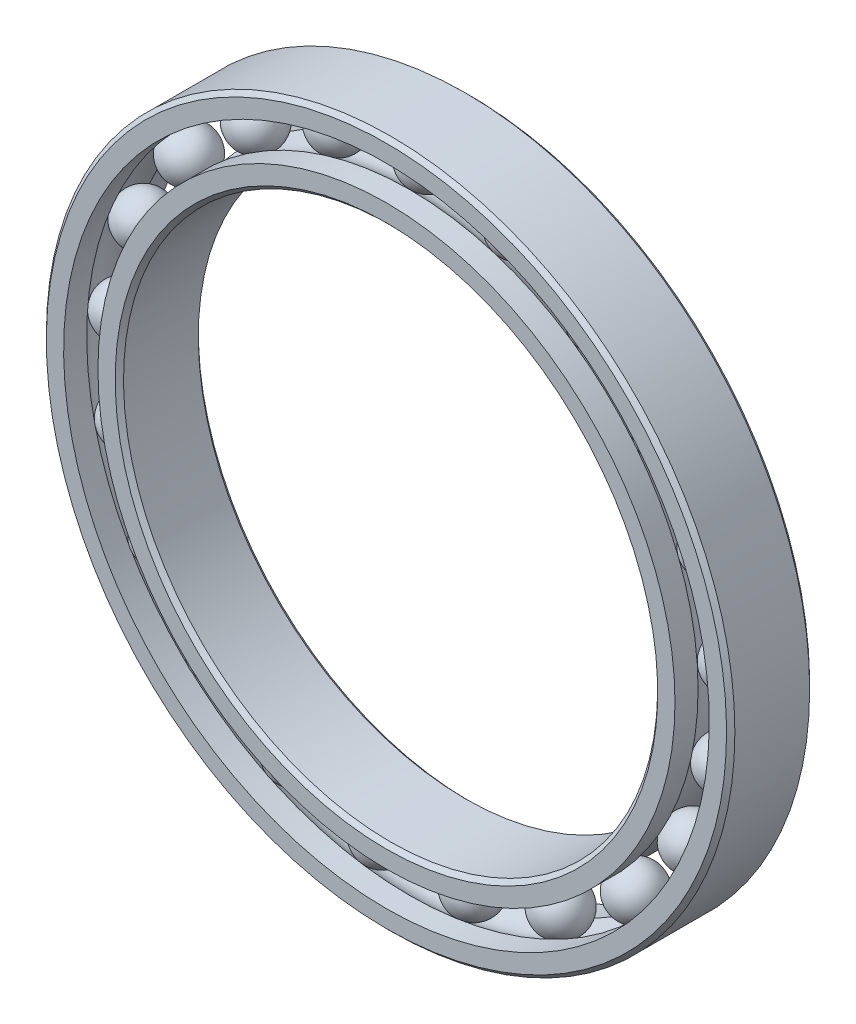
ISO-10303-21;
HEADER;
FILE_DESCRIPTION(('STEP AP214'),'2;1');
FILE_NAME('part.step','',(''),(''),'','','');
FILE_SCHEMA(('AUTOMOTIVE_DESIGN { 1 0 10303 214 1 1 1 1 }'));
ENDSEC;
DATA;
#1=APPLICATION_CONTEXT('core data for automotive mechanical design processes');
#2=APPLICATION_PROTOCOL_DEFINITION('international standard','automotive_design',2000,#1);
#3=PRODUCT_CONTEXT('',#1,'mechanical');
#4=PRODUCT('Part','Part','',(#3));
#5=PRODUCT_RELATED_PRODUCT_CATEGORY('part','',(#4));
#6=PRODUCT_DEFINITION_FORMATION('','',#4);
#7=PRODUCT_DEFINITION_CONTEXT('part definition',#1,'design');
#8=PRODUCT_DEFINITION('design','',#6,#7);
#9=PRODUCT_DEFINITION_SHAPE('','',#8);
#10=(LENGTH_UNIT() NAMED_UNIT(*) SI_UNIT(.MILLI.,.METRE.));
#11=(NAMED_UNIT(*) PLANE_ANGLE_UNIT() SI_UNIT($,.RADIAN.));
#12=(NAMED_UNIT(*) SI_UNIT($,.STERADIAN.) SOLID_ANGLE_UNIT());
#13=UNCERTAINTY_MEASURE_WITH_UNIT(LENGTH_MEASURE(1.E-05),#10,'distance_accuracy_value','');
#14=(GEOMETRIC_REPRESENTATION_CONTEXT(3) GLOBAL_UNCERTAINTY_ASSIGNED_CONTEXT((#13)) GLOBAL_UNIT_ASSIGNED_CONTEXT((#10,
#11,#12)) REPRESENTATION_CONTEXT('',''));
#15=CARTESIAN_POINT('',(0.,0.,0.));
#16=DIRECTION('',(0.,0.,1.));
#17=DIRECTION('',(1.,0.,0.));
#18=AXIS2_PLACEMENT_3D('',#15,#16,#17);
#19=CARTESIAN_POINT('',(7.58994574108045,24.6059997489932,0.));
#20=DIRECTION('',(0.,0.,1.));
#21=DIRECTION('',(0.294755174410891,0.955572805786145,0.));
#22=AXIS2_PLACEMENT_3D('',#19,#20,#21);
#23=SPHERICAL_SURFACE('',#22,2.12277479717142);
#24=CARTESIAN_POINT('',(7.58994574108045,24.6059997489932,2.12277479717142));
#25=VERTEX_POINT('',#24);
#26=VERTEX_LOOP('',#25);
#27=FACE_BOUND('',#26,.T.);
#28=ADVANCED_FACE('F42',(#27),#23,.T.);
#29=CLOSED_SHELL('',(#28));
#30=MANIFOLD_SOLID_BREP('B2',#29);
#31=CARTESIAN_POINT('',(14.505491495138,21.2756484386371,0.));
#32=DIRECTION('',(0.,0.,1.));
#33=DIRECTION('',(0.563320058063612,0.826238774316002,0.));
#34=AXIS2_PLACEMENT_3D('',#31,#32,#33);
#35=SPHERICAL_SURFACE('',#34,2.12277479717142);
#36=CARTESIAN_POINT('',(14.505491495138,21.2756484386371,2.12277479717142));
#37=VERTEX_POINT('',#36);
#38=VERTEX_LOOP('',#37);
#39=FACE_BOUND('',#38,.T.);
#40=ADVANCED_FACE('F59',(#39),#35,.T.);
#41=CLOSED_SHELL('',(#40));
#42=MANIFOLD_SOLID_BREP('B6',#41);
#43=CARTESIAN_POINT('',(20.1321606735516,16.0548623978626,0.));
#44=DIRECTION('',(0.,0.,1.));
#45=DIRECTION('',(0.781831482468022,0.623489801858743,0.));
#46=AXIS2_PLACEMENT_3D('',#43,#44,#45);
#47=SPHERICAL_SURFACE('',#46,2.12277479717142);
#48=CARTESIAN_POINT('',(20.1321606735516,16.0548623978626,2.12277479717142));
#49=VERTEX_POINT('',#48);
#50=VERTEX_LOOP('',#49);
#51=FACE_BOUND('',#50,.T.);
#52=ADVANCED_FACE('F76',(#51),#47,.T.);
#53=CLOSED_SHELL('',(#52));
#54=MANIFOLD_SOLID_BREP('B38',#53);
#55=CARTESIAN_POINT('',(23.9699990275882,9.40753137743494,0.));
#56=DIRECTION('',(0.,0.,1.));
#57=DIRECTION('',(0.9308737486442,0.365341024366405,0.));
#58=AXIS2_PLACEMENT_3D('',#55,#56,#57);
#59=SPHERICAL_SURFACE('',#58,2.12277479717142);
#60=CARTESIAN_POINT('',(23.9699990275882,9.40753137743494,2.12277479717141));
#61=VERTEX_POINT('',#60);
#62=VERTEX_LOOP('',#61);
#63=FACE_BOUND('',#62,.T.);
#64=ADVANCED_FACE('F93',(#63),#59,.T.);
#65=CLOSED_SHELL('',(#64));
#66=MANIFOLD_SOLID_BREP('B55',#65);
#67=CARTESIAN_POINT('',(25.6779977774154,1.9242999098507,0.));
#68=DIRECTION('',(0.,0.,1.));
#69=DIRECTION('',(0.997203797181179,0.074730093586435,0.));
#70=AXIS2_PLACEMENT_3D('',#67,#68,#69);
#71=SPHERICAL_SURFACE('',#70,2.12277479717142);
#72=CARTESIAN_POINT('',(25.6779977774154,1.9242999098507,2.12277479717141));
#73=VERTEX_POINT('',#72);
#74=VERTEX_LOOP('',#73);
#75=FACE_BOUND('',#74,.T.);
#76=ADVANCED_FACE('F110',(#75),#71,.T.);
#77=CLOSED_SHELL('',(#76));
#78=MANIFOLD_SOLID_BREP('B72',#77);
#79=CARTESIAN_POINT('',(25.104393738682,-5.72991404937483,0.));
#80=DIRECTION('',(0.,0.,1.));
#81=DIRECTION('',(0.974927912181826,-0.222520933956304,0.));
#82=AXIS2_PLACEMENT_3D('',#79,#80,#81);
#83=SPHERICAL_SURFACE('',#82,2.12277479717142);
#84=CARTESIAN_POINT('',(25.104393738682,-5.72991404937483,2.12277479717141));
#85=VERTEX_POINT('',#84);
#86=VERTEX_LOOP('',#85);
#87=FACE_BOUND('',#86,.T.);
#88=ADVANCED_FACE('F127',(#87),#83,.T.);
#89=CLOSED_SHELL('',(#88));
#90=MANIFOLD_SOLID_BREP('B89',#89);
#91=CARTESIAN_POINT('',(22.3001541474494,-12.8749999999998,0.));
#92=DIRECTION('',(0.,0.,1.));
#93=DIRECTION('',(0.866025403784443,-0.499999999999992,0.));
#94=AXIS2_PLACEMENT_3D('',#91,#92,#93);
#95=SPHERICAL_SURFACE('',#94,2.12277479717142);
#96=CARTESIAN_POINT('',(22.3001541474494,-12.8749999999998,2.12277479717141));
#97=VERTEX_POINT('',#96);
#98=VERTEX_LOOP('',#97);
#99=FACE_BOUND('',#98,.T.);
#100=ADVANCED_FACE('F144',(#99),#95,.T.);
#101=CLOSED_SHELL('',(#100));
#102=MANIFOLD_SOLID_BREP('B106',#101);
#103=CARTESIAN_POINT('',(17.5144479976013,-18.8760856996179,0.));
#104=DIRECTION('',(0.,0.,1.));
#105=DIRECTION('',(0.680172737770926,-0.73305187182982,0.));
#106=AXIS2_PLACEMENT_3D('',#103,#104,#105);
#107=SPHERICAL_SURFACE('',#106,2.12277479717142);
#108=CARTESIAN_POINT('',(17.5144479976013,-18.8760856996179,2.12277479717141));
#109=VERTEX_POINT('',#108);
#110=VERTEX_LOOP('',#109);
#111=FACE_BOUND('',#110,.T.);
#112=ADVANCED_FACE('F161',(#111),#107,.T.);
#113=CLOSED_SHELL('',(#112));
#114=MANIFOLD_SOLID_BREP('B123',#113);
#115=CARTESIAN_POINT('',(11.1725062822773,-23.1999483484872,0.));
#116=DIRECTION('',(0.,0.,1.));
#117=DIRECTION('',(0.433883739117565,-0.900968867902416,0.));
#118=AXIS2_PLACEMENT_3D('',#115,#116,#117);
#119=SPHERICAL_SURFACE('',#118,2.12277479717142);
#120=CARTESIAN_POINT('',(11.1725062822773,-23.1999483484872,2.12277479717141));
#121=VERTEX_POINT('',#120);
#122=VERTEX_LOOP('',#121);
#123=FACE_BOUND('',#122,.T.);
#124=ADVANCED_FACE('F178',(#123),#119,.T.);
#125=CLOSED_SHELL('',(#124));
#126=MANIFOLD_SOLID_BREP('B140',#125);
#127=CARTESIAN_POINT('',(3.83783835403668,-25.462393775297,0.));
#128=DIRECTION('',(0.,0.,1.));
#129=DIRECTION('',(0.149042266176182,-0.988830826225127,0.));
#130=AXIS2_PLACEMENT_3D('',#127,#128,#129);
#131=SPHERICAL_SURFACE('',#130,2.12277479717142);
#132=CARTESIAN_POINT('',(3.83783835403668,-25.462393775297,2.12277479717141));
#133=VERTEX_POINT('',#132);
#134=VERTEX_LOOP('',#133);
#135=FACE_BOUND('',#134,.T.);
#136=ADVANCED_FACE('F195',(#135),#131,.T.);
#137=CLOSED_SHELL('',(#136));
#138=MANIFOLD_SOLID_BREP('B157',#137);
#139=CARTESIAN_POINT('',(-3.83783835403632,-25.4623937752971,0.));
#140=DIRECTION('',(0.,0.,1.));
#141=DIRECTION('',(-0.149042266176168,-0.98883082622513,0.));
#142=AXIS2_PLACEMENT_3D('',#139,#140,#141);
#143=SPHERICAL_SURFACE('',#142,2.12277479717142);
#144=CARTESIAN_POINT('',(-3.83783835403632,-25.4623937752971,2.12277479717141));
#145=VERTEX_POINT('',#144);
#146=VERTEX_LOOP('',#145);
#147=FACE_BOUND('',#146,.T.);
#148=ADVANCED_FACE('F212',(#147),#143,.T.);
#149=CLOSED_SHELL('',(#148));
#150=MANIFOLD_SOLID_BREP('B174',#149);
#151=CARTESIAN_POINT('',(-11.172506282277,-23.1999483484874,0.));
#152=DIRECTION('',(0.,0.,1.));
#153=DIRECTION('',(-0.433883739117553,-0.900968867902422,0.));
#154=AXIS2_PLACEMENT_3D('',#151,#152,#153);
#155=SPHERICAL_SURFACE('',#154,2.12277479717142);
#156=CARTESIAN_POINT('',(-11.172506282277,-23.1999483484874,2.12277479717141));
#157=VERTEX_POINT('',#156);
#158=VERTEX_LOOP('',#157);
#159=FACE_BOUND('',#158,.T.);
#160=ADVANCED_FACE('F229',(#159),#155,.T.);
#161=CLOSED_SHELL('',(#160));
#162=MANIFOLD_SOLID_BREP('B191',#161);
#163=CARTESIAN_POINT('',(-17.5144479976011,-18.8760856996181,0.));
#164=DIRECTION('',(0.,0.,1.));
#165=DIRECTION('',(-0.680172737770915,-0.73305187182983,0.));
#166=AXIS2_PLACEMENT_3D('',#163,#164,#165);
#167=SPHERICAL_SURFACE('',#166,2.12277479717142);
#168=CARTESIAN_POINT('',(-17.5144479976011,-18.8760856996181,2.12277479717141));
#169=VERTEX_POINT('',#168);
#170=VERTEX_LOOP('',#169);
#171=FACE_BOUND('',#170,.T.);
#172=ADVANCED_FACE('F246',(#171),#167,.T.);
#173=CLOSED_SHELL('',(#172));
#174=MANIFOLD_SOLID_BREP('B208',#173);
#175=CARTESIAN_POINT('',(-22.3001541474492,-12.8750000000001,0.));
#176=DIRECTION('',(0.,0.,1.));
#177=DIRECTION('',(-0.866025403784436,-0.500000000000004,0.));
#178=AXIS2_PLACEMENT_3D('',#175,#176,#177);
#179=SPHERICAL_SURFACE('',#178,2.12277479717142);
#180=CARTESIAN_POINT('',(-22.3001541474492,-12.8750000000001,2.12277479717141));
#181=VERTEX_POINT('',#180);
#182=VERTEX_LOOP('',#181);
#183=FACE_BOUND('',#182,.T.);
#184=ADVANCED_FACE('F263',(#183),#179,.T.);
#185=CLOSED_SHELL('',(#184));
#186=MANIFOLD_SOLID_BREP('B225',#185);
#187=CARTESIAN_POINT('',(-25.1043937386819,-5.72991404937519,0.));
#188=DIRECTION('',(0.,0.,1.));
#189=DIRECTION('',(-0.974927912181823,-0.222520933956318,0.));
#190=AXIS2_PLACEMENT_3D('',#187,#188,#189);
#191=SPHERICAL_SURFACE('',#190,2.12277479717142);
#192=CARTESIAN_POINT('',(-25.1043937386819,-5.72991404937519,2.12277479717141));
#193=VERTEX_POINT('',#192);
#194=VERTEX_LOOP('',#193);
#195=FACE_BOUND('',#194,.T.);
#196=ADVANCED_FACE('F280',(#195),#191,.T.);
#197=CLOSED_SHELL('',(#196));
#198=MANIFOLD_SOLID_BREP('B242',#197);
#199=CARTESIAN_POINT('',(-25.6779977774154,1.92429990985034,0.));
#200=DIRECTION('',(0.,0.,1.));
#201=DIRECTION('',(-0.997203797181181,0.0747300935864209,0.));
#202=AXIS2_PLACEMENT_3D('',#199,#200,#201);
#203=SPHERICAL_SURFACE('',#202,2.12277479717142);
#204=CARTESIAN_POINT('',(-25.6779977774154,1.92429990985034,2.12277479717141));
#205=VERTEX_POINT('',#204);
#206=VERTEX_LOOP('',#205);
#207=FACE_BOUND('',#206,.T.);
#208=ADVANCED_FACE('F297',(#207),#203,.T.);
#209=CLOSED_SHELL('',(#208));
#210=MANIFOLD_SOLID_BREP('B259',#209);
#211=CARTESIAN_POINT('',(-23.9699990275883,9.40753137743461,0.));
#212=DIRECTION('',(0.,0.,1.));
#213=DIRECTION('',(-0.930873748644205,0.365341024366392,0.));
#214=AXIS2_PLACEMENT_3D('',#211,#212,#213);
#215=SPHERICAL_SURFACE('',#214,2.12277479717142);
#216=CARTESIAN_POINT('',(-23.9699990275883,9.40753137743461,2.12277479717141));
#217=VERTEX_POINT('',#216);
#218=VERTEX_LOOP('',#217);
#219=FACE_BOUND('',#218,.T.);
#220=ADVANCED_FACE('F314',(#219),#215,.T.);
#221=CLOSED_SHELL('',(#220));
#222=MANIFOLD_SOLID_BREP('B276',#221);
#223=CARTESIAN_POINT('',(-20.1321606735518,16.0548623978624,0.));
#224=DIRECTION('',(0.,0.,1.));
#225=DIRECTION('',(-0.781831482468031,0.623489801858732,0.));
#226=AXIS2_PLACEMENT_3D('',#223,#224,#225);
#227=SPHERICAL_SURFACE('',#226,2.12277479717142);
#228=CARTESIAN_POINT('',(-20.1321606735518,16.0548623978624,2.12277479717142));
#229=VERTEX_POINT('',#228);
#230=VERTEX_LOOP('',#229);
#231=FACE_BOUND('',#230,.T.);
#232=ADVANCED_FACE('F331',(#231),#227,.T.);
#233=CLOSED_SHELL('',(#232));
#234=MANIFOLD_SOLID_BREP('B293',#233);
#235=CARTESIAN_POINT('',(-14.5054914951383,21.2756484386368,0.));
#236=DIRECTION('',(0.,0.,1.));
#237=DIRECTION('',(-0.563320058063623,0.826238774315994,0.));
#238=AXIS2_PLACEMENT_3D('',#235,#236,#237);
#239=SPHERICAL_SURFACE('',#238,2.12277479717142);
#240=CARTESIAN_POINT('',(-14.5054914951383,21.2756484386368,2.12277479717142));
#241=VERTEX_POINT('',#240);
#242=VERTEX_LOOP('',#241);
#243=FACE_BOUND('',#242,.T.);
#244=ADVANCED_FACE('F348',(#243),#239,.T.);
#245=CLOSED_SHELL('',(#244));
#246=MANIFOLD_SOLID_BREP('B310',#245);
#247=CARTESIAN_POINT('',(-7.5899457410808,24.6059997489931,0.));
#248=DIRECTION('',(0.,0.,1.));
#249=DIRECTION('',(-0.294755174410905,0.955572805786141,0.));
#250=AXIS2_PLACEMENT_3D('',#247,#248,#249);
#251=SPHERICAL_SURFACE('',#250,2.12277479717142);
#252=CARTESIAN_POINT('',(-7.5899457410808,24.6059997489931,2.12277479717142));
#253=VERTEX_POINT('',#252);
#254=VERTEX_LOOP('',#253);
#255=FACE_BOUND('',#254,.T.);
#256=ADVANCED_FACE('F365',(#255),#251,.T.);
#257=CLOSED_SHELL('',(#256));
#258=MANIFOLD_SOLID_BREP('B327',#257);
#259=CARTESIAN_POINT('',(0.,25.75,0.));
#260=DIRECTION('',(0.,0.,1.));
#261=DIRECTION('',(0.,1.,0.));
#262=AXIS2_PLACEMENT_3D('',#259,#260,#261);
#263=SPHERICAL_SURFACE('',#262,2.12277479717142);
#264=CARTESIAN_POINT('',(0.,25.75,2.12277479717142));
#265=VERTEX_POINT('',#264);
#266=VERTEX_LOOP('',#265);
#267=FACE_BOUND('',#266,.T.);
#268=ADVANCED_FACE('F384',(#267),#263,.T.);
#269=CLOSED_SHELL('',(#268));
#270=MANIFOLD_SOLID_BREP('B344',#269);
#271=CARTESIAN_POINT('',(0.,24.3055555555556,3.50000000000001));
#272=DIRECTION('',(0.,0.,-1.));
#273=DIRECTION('',(0.,1.,0.));
#274=AXIS2_PLACEMENT_3D('',#271,#272,#273);
#275=PLANE('',#274);
#276=CARTESIAN_POINT('',(0.,0.,3.5));
#277=DIRECTION('',(0.,0.,1.));
#278=DIRECTION('',(0.,-1.,0.));
#279=AXIS2_PLACEMENT_3D('',#276,#277,#278);
#280=CIRCLE('',#279,22.85);
#281=CARTESIAN_POINT('',(0.,-22.85,3.5));
#282=VERTEX_POINT('',#281);
#283=EDGE_CURVE('E430',#282,#282,#280,.T.);
#284=ORIENTED_EDGE('',*,*,#283,.F.);
#285=EDGE_LOOP('',(#284));
#286=FACE_BOUND('',#285,.T.);
#287=CARTESIAN_POINT('',(0.,0.,3.5));
#288=DIRECTION('',(0.,0.,1.));
#289=DIRECTION('',(0.,-1.,0.));
#290=AXIS2_PLACEMENT_3D('',#287,#288,#289);
#291=CIRCLE('',#290,24.3055555555556);
#292=CARTESIAN_POINT('',(0.,-24.3055555555556,3.5));
#293=VERTEX_POINT('',#292);
#294=EDGE_CURVE('E383',#293,#293,#291,.T.);
#295=ORIENTED_EDGE('',*,*,#294,.T.);
#296=EDGE_LOOP('',(#295));
#297=FACE_BOUND('',#296,.T.);
#298=ADVANCED_FACE('F402',(#286,#297),#275,.F.);
#299=CARTESIAN_POINT('',(0.,0.,3.49999999999999));
#300=DIRECTION('',(0.,0.,1.));
#301=DIRECTION('',(0.,-1.,0.));
#302=AXIS2_PLACEMENT_3D('',#299,#300,#301);
#303=CYLINDRICAL_SURFACE('',#302,24.3055555555556);
#304=ORIENTED_EDGE('',*,*,#294,.F.);
#305=EDGE_LOOP('',(#304));
#306=FACE_BOUND('',#305,.T.);
#307=CARTESIAN_POINT('',(0.,0.,1.55555555555555));
#308=DIRECTION('',(0.,0.,1.));
#309=DIRECTION('',(0.,-1.,0.));
#310=AXIS2_PLACEMENT_3D('',#307,#308,#309);
#311=CIRCLE('',#310,24.3055555555556);
#312=CARTESIAN_POINT('',(0.,-24.3055555555556,1.55555555555555));
#313=VERTEX_POINT('',#312);
#314=EDGE_CURVE('E408',#313,#313,#311,.T.);
#315=ORIENTED_EDGE('',*,*,#314,.T.);
#316=EDGE_LOOP('',(#315));
#317=FACE_BOUND('',#316,.T.);
#318=ADVANCED_FACE('F437',(#306,#317),#303,.T.);
#319=CARTESIAN_POINT('',(0.,0.,0.));
#320=DIRECTION('',(0.,0.,1.));
#321=DIRECTION('',(0.,-1.,0.));
#322=AXIS2_PLACEMENT_3D('',#319,#320,#321);
#323=TOROIDAL_SURFACE('',#322,25.75,2.12277479717142);
#324=ORIENTED_EDGE('',*,*,#314,.F.);
#325=EDGE_LOOP('',(#324));
#326=FACE_BOUND('',#325,.T.);
#327=CARTESIAN_POINT('',(0.,0.,-1.55555555555555));
#328=DIRECTION('',(0.,0.,1.));
#329=DIRECTION('',(0.,-1.,0.));
#330=AXIS2_PLACEMENT_3D('',#327,#328,#329);
#331=CIRCLE('',#330,24.3055555555556);
#332=CARTESIAN_POINT('',(0.,-24.3055555555556,-1.55555555555556));
#333=VERTEX_POINT('',#332);
#334=EDGE_CURVE('E412',#333,#333,#331,.T.);
#335=ORIENTED_EDGE('',*,*,#334,.T.);
#336=EDGE_LOOP('',(#335));
#337=FACE_BOUND('',#336,.T.);
#338=ADVANCED_FACE('F441',(#326,#337),#323,.F.);
#339=CARTESIAN_POINT('',(0.,0.,3.49999999999999));
#340=DIRECTION('',(0.,0.,1.));
#341=DIRECTION('',(0.,-1.,0.));
#342=AXIS2_PLACEMENT_3D('',#339,#340,#341);
#343=CYLINDRICAL_SURFACE('',#342,24.3055555555556);
#344=ORIENTED_EDGE('',*,*,#334,.F.);
#345=EDGE_LOOP('',(#344));
#346=FACE_BOUND('',#345,.T.);
#347=CARTESIAN_POINT('',(0.,0.,-3.50000000000001));
#348=DIRECTION('',(0.,0.,1.));
#349=DIRECTION('',(0.,-1.,0.));
#350=AXIS2_PLACEMENT_3D('',#347,#348,#349);
#351=CIRCLE('',#350,24.3055555555556);
#352=CARTESIAN_POINT('',(0.,-24.3055555555556,-3.50000000000001));
#353=VERTEX_POINT('',#352);
#354=EDGE_CURVE('E416',#353,#353,#351,.T.);
#355=ORIENTED_EDGE('',*,*,#354,.T.);
#356=EDGE_LOOP('',(#355));
#357=FACE_BOUND('',#356,.T.);
#358=ADVANCED_FACE('F446',(#346,#357),#343,.T.);
#359=CARTESIAN_POINT('',(0.,22.85,-3.50000000000001));
#360=DIRECTION('',(0.,0.,1.));
#361=DIRECTION('',(0.,-1.,0.));
#362=AXIS2_PLACEMENT_3D('',#359,#360,#361);
#363=PLANE('',#362);
#364=ORIENTED_EDGE('',*,*,#354,.F.);
#365=EDGE_LOOP('',(#364));
#366=FACE_BOUND('',#365,.T.);
#367=CARTESIAN_POINT('',(0.,0.,-3.50000000000001));
#368=DIRECTION('',(0.,0.,1.));
#369=DIRECTION('',(0.,-1.,0.));
#370=AXIS2_PLACEMENT_3D('',#367,#368,#369);
#371=CIRCLE('',#370,22.85);
#372=CARTESIAN_POINT('',(0.,-22.85,-3.50000000000002));
#373=VERTEX_POINT('',#372);
#374=EDGE_CURVE('E421',#373,#373,#371,.T.);
#375=ORIENTED_EDGE('',*,*,#374,.T.);
#376=EDGE_LOOP('',(#375));
#377=FACE_BOUND('',#376,.T.);
#378=ADVANCED_FACE('F452',(#366,#377),#363,.F.);
#379=CARTESIAN_POINT('',(0.,0.,-3.15000000000001));
#380=DIRECTION('',(0.,0.,-1.));
#381=DIRECTION('',(0.,1.,0.));
#382=AXIS2_PLACEMENT_3D('',#379,#380,#381);
#383=CONICAL_SURFACE('',#382,22.5,0.785398163397414);
#384=ORIENTED_EDGE('',*,*,#374,.F.);
#385=EDGE_LOOP('',(#384));
#386=FACE_BOUND('',#385,.T.);
#387=CARTESIAN_POINT('',(0.,0.,-3.15000000000001));
#388=DIRECTION('',(0.,0.,1.));
#389=DIRECTION('',(0.,-1.,0.));
#390=AXIS2_PLACEMENT_3D('',#387,#388,#389);
#391=CIRCLE('',#390,22.5);
#392=CARTESIAN_POINT('',(0.,-22.5,-3.15000000000001));
#393=VERTEX_POINT('',#392);
#394=EDGE_CURVE('E424',#393,#393,#391,.T.);
#395=ORIENTED_EDGE('',*,*,#394,.T.);
#396=EDGE_LOOP('',(#395));
#397=FACE_BOUND('',#396,.T.);
#398=ADVANCED_FACE('F456',(#386,#397),#383,.F.);
#399=CARTESIAN_POINT('',(0.,0.,3.49999999999999));
#400=DIRECTION('',(0.,0.,1.));
#401=DIRECTION('',(0.,-1.,0.));
#402=AXIS2_PLACEMENT_3D('',#399,#400,#401);
#403=CYLINDRICAL_SURFACE('',#402,22.5);
#404=ORIENTED_EDGE('',*,*,#394,.F.);
#405=EDGE_LOOP('',(#404));
#406=FACE_BOUND('',#405,.T.);
#407=CARTESIAN_POINT('',(0.,0.,3.15000000000002));
#408=DIRECTION('',(0.,0.,1.));
#409=DIRECTION('',(0.,-1.,0.));
#410=AXIS2_PLACEMENT_3D('',#407,#408,#409);
#411=CIRCLE('',#410,22.5);
#412=CARTESIAN_POINT('',(0.,-22.5,3.15000000000002));
#413=VERTEX_POINT('',#412);
#414=EDGE_CURVE('E427',#413,#413,#411,.T.);
#415=ORIENTED_EDGE('',*,*,#414,.T.);
#416=EDGE_LOOP('',(#415));
#417=FACE_BOUND('',#416,.T.);
#418=ADVANCED_FACE('F460',(#406,#417),#403,.F.);
#419=CARTESIAN_POINT('',(0.,0.,3.5));
#420=DIRECTION('',(0.,0.,1.));
#421=DIRECTION('',(0.,-1.,0.));
#422=AXIS2_PLACEMENT_3D('',#419,#420,#421);
#423=CONICAL_SURFACE('',#422,22.85,0.785398163397467);
#424=ORIENTED_EDGE('',*,*,#414,.F.);
#425=EDGE_LOOP('',(#424));
#426=FACE_BOUND('',#425,.T.);
#427=ORIENTED_EDGE('',*,*,#283,.T.);
#428=EDGE_LOOP('',(#427));
#429=FACE_BOUND('',#428,.T.);
#430=ADVANCED_FACE('F434',(#426,#429),#423,.F.);
#431=CLOSED_SHELL('',(#298,#318,#338,#358,#378,#398,#418,#430));
#432=MANIFOLD_SOLID_BREP('B361',#431);
#433=CARTESIAN_POINT('',(0.,0.,3.49999999999999));
#434=DIRECTION('',(0.,0.,1.));
#435=DIRECTION('',(0.,-1.,0.));
#436=AXIS2_PLACEMENT_3D('',#433,#434,#435);
#437=CYLINDRICAL_SURFACE('',#436,29.);
#438=CARTESIAN_POINT('',(0.,0.,3.15));
#439=DIRECTION('',(0.,0.,1.));
#440=DIRECTION('',(0.,-1.,0.));
#441=AXIS2_PLACEMENT_3D('',#438,#439,#440);
#442=CIRCLE('',#441,29.);
#443=CARTESIAN_POINT('',(0.,-29.,3.14999999999999));
#444=VERTEX_POINT('',#443);
#445=EDGE_CURVE('E401',#444,#444,#442,.T.);
#446=ORIENTED_EDGE('',*,*,#445,.F.);
#447=EDGE_LOOP('',(#446));
#448=FACE_BOUND('',#447,.T.);
#449=CARTESIAN_POINT('',(0.,0.,-3.15000000000001));
#450=DIRECTION('',(0.,0.,1.));
#451=DIRECTION('',(0.,-1.,0.));
#452=AXIS2_PLACEMENT_3D('',#449,#450,#451);
#453=CIRCLE('',#452,29.);
#454=CARTESIAN_POINT('',(0.,-29.,-3.15000000000001));
#455=VERTEX_POINT('',#454);
#456=EDGE_CURVE('E536',#455,#455,#453,.T.);
#457=ORIENTED_EDGE('',*,*,#456,.T.);
#458=EDGE_LOOP('',(#457));
#459=FACE_BOUND('',#458,.T.);
#460=ADVANCED_FACE('F508',(#448,#459),#437,.T.);
#461=CARTESIAN_POINT('',(0.,0.,3.15));
#462=DIRECTION('',(0.,0.,-1.));
#463=DIRECTION('',(0.,1.,0.));
#464=AXIS2_PLACEMENT_3D('',#461,#462,#463);
#465=CONICAL_SURFACE('',#464,29.,0.785398163397433);
#466=CARTESIAN_POINT('',(0.,0.,3.49999999999999));
#467=DIRECTION('',(0.,0.,1.));
#468=DIRECTION('',(0.,-1.,0.));
#469=AXIS2_PLACEMENT_3D('',#466,#467,#468);
#470=CIRCLE('',#469,28.65);
#471=CARTESIAN_POINT('',(0.,-28.65,3.49999999999999));
#472=VERTEX_POINT('',#471);
#473=EDGE_CURVE('E514',#472,#472,#470,.T.);
#474=ORIENTED_EDGE('',*,*,#473,.F.);
#475=EDGE_LOOP('',(#474));
#476=FACE_BOUND('',#475,.T.);
#477=ORIENTED_EDGE('',*,*,#445,.T.);
#478=EDGE_LOOP('',(#477));
#479=FACE_BOUND('',#478,.T.);
#480=ADVANCED_FACE('F573',(#476,#479),#465,.T.);
#481=CARTESIAN_POINT('',(0.,28.65,3.49999999999999));
#482=DIRECTION('',(0.,0.,-1.));
#483=DIRECTION('',(0.,1.,0.));
#484=AXIS2_PLACEMENT_3D('',#481,#482,#483);
#485=PLANE('',#484);
#486=CARTESIAN_POINT('',(0.,0.,3.49999999999999));
#487=DIRECTION('',(0.,0.,1.));
#488=DIRECTION('',(0.,-1.,0.));
#489=AXIS2_PLACEMENT_3D('',#486,#487,#488);
#490=CIRCLE('',#489,27.1944444444444);
#491=CARTESIAN_POINT('',(0.,-27.1944444444444,3.49999999999999));
#492=VERTEX_POINT('',#491);
#493=EDGE_CURVE('E518',#492,#492,#490,.T.);
#494=ORIENTED_EDGE('',*,*,#493,.F.);
#495=EDGE_LOOP('',(#494));
#496=FACE_BOUND('',#495,.T.);
#497=ORIENTED_EDGE('',*,*,#473,.T.);
#498=EDGE_LOOP('',(#497));
#499=FACE_BOUND('',#498,.T.);
#500=ADVANCED_FACE('F568',(#496,#499),#485,.F.);
#501=CARTESIAN_POINT('',(0.,0.,3.49999999999999));
#502=DIRECTION('',(0.,0.,1.));
#503=DIRECTION('',(0.,-1.,0.));
#504=AXIS2_PLACEMENT_3D('',#501,#502,#503);
#505=CYLINDRICAL_SURFACE('',#504,27.1944444444444);
#506=CARTESIAN_POINT('',(0.,0.,1.55555555555555));
#507=DIRECTION('',(0.,0.,1.));
#508=DIRECTION('',(0.,-1.,0.));
#509=AXIS2_PLACEMENT_3D('',#506,#507,#508);
#510=CIRCLE('',#509,27.1944444444444);
#511=CARTESIAN_POINT('',(0.,-27.1944444444444,1.55555555555555));
#512=VERTEX_POINT('',#511);
#513=EDGE_CURVE('E522',#512,#512,#510,.T.);
#514=ORIENTED_EDGE('',*,*,#513,.F.);
#515=EDGE_LOOP('',(#514));
#516=FACE_BOUND('',#515,.T.);
#517=ORIENTED_EDGE('',*,*,#493,.T.);
#518=EDGE_LOOP('',(#517));
#519=FACE_BOUND('',#518,.T.);
#520=ADVANCED_FACE('F562',(#516,#519),#505,.F.);
#521=CARTESIAN_POINT('',(0.,0.,0.));
#522=DIRECTION('',(0.,0.,1.));
#523=DIRECTION('',(0.,-1.,0.));
#524=AXIS2_PLACEMENT_3D('',#521,#522,#523);
#525=TOROIDAL_SURFACE('',#524,25.75,2.12277479717142);
#526=CARTESIAN_POINT('',(0.,0.,-1.55555555555556));
#527=DIRECTION('',(0.,0.,1.));
#528=DIRECTION('',(0.,-1.,0.));
#529=AXIS2_PLACEMENT_3D('',#526,#527,#528);
#530=CIRCLE('',#529,27.1944444444444);
#531=CARTESIAN_POINT('',(0.,-27.1944444444444,-1.55555555555557));
#532=VERTEX_POINT('',#531);
#533=EDGE_CURVE('E527',#532,#532,#530,.T.);
#534=ORIENTED_EDGE('',*,*,#533,.F.);
#535=EDGE_LOOP('',(#534));
#536=FACE_BOUND('',#535,.T.);
#537=ORIENTED_EDGE('',*,*,#513,.T.);
#538=EDGE_LOOP('',(#537));
#539=FACE_BOUND('',#538,.T.);
#540=ADVANCED_FACE('F556',(#536,#539),#525,.F.);
#541=CARTESIAN_POINT('',(0.,0.,3.49999999999999));
#542=DIRECTION('',(0.,0.,1.));
#543=DIRECTION('',(0.,-1.,0.));
#544=AXIS2_PLACEMENT_3D('',#541,#542,#543);
#545=CYLINDRICAL_SURFACE('',#544,27.1944444444444);
#546=CARTESIAN_POINT('',(0.,0.,-3.5));
#547=DIRECTION('',(0.,0.,1.));
#548=DIRECTION('',(0.,-1.,0.));
#549=AXIS2_PLACEMENT_3D('',#546,#547,#548);
#550=CIRCLE('',#549,27.1944444444444);
#551=CARTESIAN_POINT('',(0.,-27.1944444444444,-3.50000000000001));
#552=VERTEX_POINT('',#551);
#553=EDGE_CURVE('E530',#552,#552,#550,.T.);
#554=ORIENTED_EDGE('',*,*,#553,.F.);
#555=EDGE_LOOP('',(#554));
#556=FACE_BOUND('',#555,.T.);
#557=ORIENTED_EDGE('',*,*,#533,.T.);
#558=EDGE_LOOP('',(#557));
#559=FACE_BOUND('',#558,.T.);
#560=ADVANCED_FACE('F550',(#556,#559),#545,.F.);
#561=CARTESIAN_POINT('',(0.,28.65,-3.5));
#562=DIRECTION('',(0.,0.,1.));
#563=DIRECTION('',(0.,-1.,0.));
#564=AXIS2_PLACEMENT_3D('',#561,#562,#563);
#565=PLANE('',#564);
#566=CARTESIAN_POINT('',(0.,0.,-3.50000000000001));
#567=DIRECTION('',(0.,0.,1.));
#568=DIRECTION('',(0.,-1.,0.));
#569=AXIS2_PLACEMENT_3D('',#566,#567,#568);
#570=CIRCLE('',#569,28.65);
#571=CARTESIAN_POINT('',(0.,-28.65,-3.50000000000001));
#572=VERTEX_POINT('',#571);
#573=EDGE_CURVE('E533',#572,#572,#570,.T.);
#574=ORIENTED_EDGE('',*,*,#573,.F.);
#575=EDGE_LOOP('',(#574));
#576=FACE_BOUND('',#575,.T.);
#577=ORIENTED_EDGE('',*,*,#553,.T.);
#578=EDGE_LOOP('',(#577));
#579=FACE_BOUND('',#578,.T.);
#580=ADVANCED_FACE('F544',(#576,#579),#565,.F.);
#581=CARTESIAN_POINT('',(0.,0.,-3.50000000000001));
#582=DIRECTION('',(0.,0.,1.));
#583=DIRECTION('',(0.,-1.,0.));
#584=AXIS2_PLACEMENT_3D('',#581,#582,#583);
#585=CONICAL_SURFACE('',#584,28.65,0.785398163397433);
#586=ORIENTED_EDGE('',*,*,#456,.F.);
#587=EDGE_LOOP('',(#586));
#588=FACE_BOUND('',#587,.T.);
#589=ORIENTED_EDGE('',*,*,#573,.T.);
#590=EDGE_LOOP('',(#589));
#591=FACE_BOUND('',#590,.T.);
#592=ADVANCED_FACE('F541',(#588,#591),#585,.T.);
#593=CLOSED_SHELL('',(#460,#480,#500,#520,#540,#560,#580,#592));
#594=MANIFOLD_SOLID_BREP('B378',#593);
#595=ADVANCED_BREP_SHAPE_REPRESENTATION('',(#18,#30,#42,#54,#66,#78,#90,#102,#114,#126,#138,
#150,#162,#174,#186,#198,#210,#222,#234,#246,#258,#270,#432,#594),#14);
#596=SHAPE_DEFINITION_REPRESENTATION(#9,#595);
ENDSEC;
END-ISO-10303-21;
